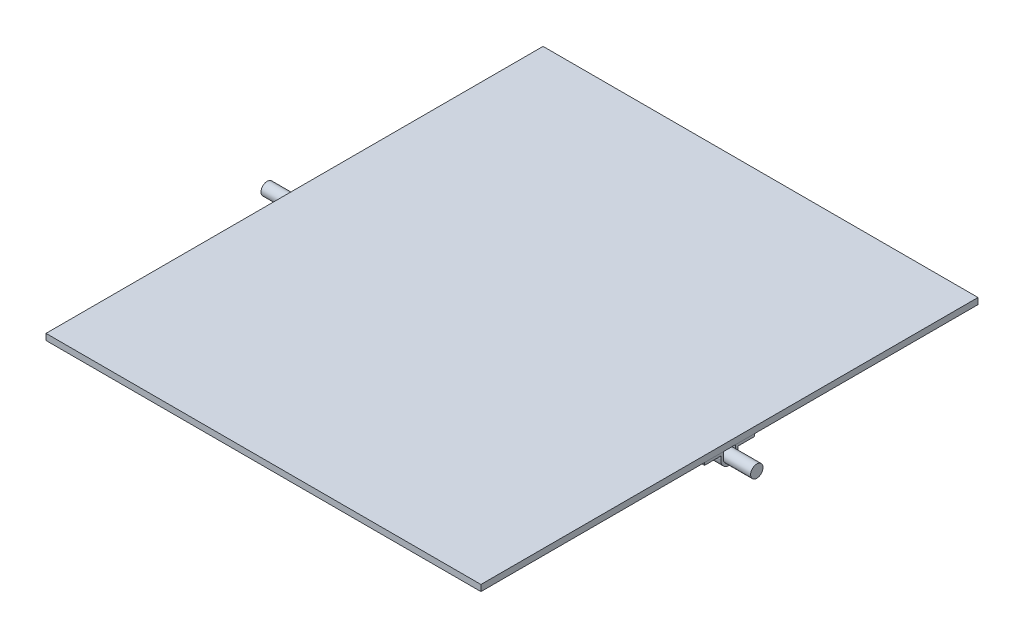
ISO-10303-21;
HEADER;
FILE_DESCRIPTION(('STEP AP214'),'2;1');
FILE_NAME('part.step','',(''),(''),'','','');
FILE_SCHEMA(('AUTOMOTIVE_DESIGN { 1 0 10303 214 1 1 1 1 }'));
ENDSEC;
DATA;
#1=APPLICATION_CONTEXT('core data for automotive mechanical design processes');
#2=APPLICATION_PROTOCOL_DEFINITION('international standard','automotive_design',2000,#1);
#3=PRODUCT_CONTEXT('',#1,'mechanical');
#4=PRODUCT('Part','Part','',(#3));
#5=PRODUCT_RELATED_PRODUCT_CATEGORY('part','',(#4));
#6=PRODUCT_DEFINITION_FORMATION('','',#4);
#7=PRODUCT_DEFINITION_CONTEXT('part definition',#1,'design');
#8=PRODUCT_DEFINITION('design','',#6,#7);
#9=PRODUCT_DEFINITION_SHAPE('','',#8);
#10=(LENGTH_UNIT() NAMED_UNIT(*) SI_UNIT(.MILLI.,.METRE.));
#11=(NAMED_UNIT(*) PLANE_ANGLE_UNIT() SI_UNIT($,.RADIAN.));
#12=(NAMED_UNIT(*) SI_UNIT($,.STERADIAN.) SOLID_ANGLE_UNIT());
#13=UNCERTAINTY_MEASURE_WITH_UNIT(LENGTH_MEASURE(1.E-05),#10,'distance_accuracy_value','');
#14=(GEOMETRIC_REPRESENTATION_CONTEXT(3) GLOBAL_UNCERTAINTY_ASSIGNED_CONTEXT((#13)) GLOBAL_UNIT_ASSIGNED_CONTEXT((#10,
#11,#12)) REPRESENTATION_CONTEXT('',''));
#15=CARTESIAN_POINT('',(0.,0.,0.));
#16=DIRECTION('',(0.,0.,1.));
#17=DIRECTION('',(1.,0.,0.));
#18=AXIS2_PLACEMENT_3D('',#15,#16,#17);
#19=CARTESIAN_POINT('',(175.,-0.01,200.01));
#20=DIRECTION('',(1.,0.,0.));
#21=DIRECTION('',(0.,0.,-1.));
#22=AXIS2_PLACEMENT_3D('',#19,#20,#21);
#23=PLANE('',#22);
#24=DIRECTION('',(0.,0.,-1.));
#25=VECTOR('',#24,1.);
#26=CARTESIAN_POINT('',(175.,5.,0.));
#27=LINE('',#26,#25);
#28=CARTESIAN_POINT('',(175.,5.,200.));
#29=VERTEX_POINT('',#28);
#30=CARTESIAN_POINT('',(175.,5.,-200.));
#31=VERTEX_POINT('',#30);
#32=EDGE_CURVE('P0_E69',#29,#31,#27,.T.);
#33=ORIENTED_EDGE('',*,*,#32,.F.);
#34=DIRECTION('',(0.,1.,0.));
#35=VECTOR('',#34,1.);
#36=CARTESIAN_POINT('',(175.,2.5,200.));
#37=LINE('',#36,#35);
#38=CARTESIAN_POINT('',(175.,0.,200.));
#39=VERTEX_POINT('',#38);
#40=EDGE_CURVE('P0_E56',#39,#29,#37,.T.);
#41=ORIENTED_EDGE('',*,*,#40,.F.);
#42=DIRECTION('',(0.,0.,1.));
#43=VECTOR('',#42,1.);
#44=CARTESIAN_POINT('',(175.,0.,0.));
#45=LINE('',#44,#43);
#46=CARTESIAN_POINT('',(175.,0.,-200.));
#47=VERTEX_POINT('',#46);
#48=EDGE_CURVE('P0_E21',#47,#39,#45,.T.);
#49=ORIENTED_EDGE('',*,*,#48,.F.);
#50=DIRECTION('',(0.,-1.,0.));
#51=VECTOR('',#50,1.);
#52=CARTESIAN_POINT('',(175.,2.5,-200.));
#53=LINE('',#52,#51);
#54=EDGE_CURVE('P0_E82',#31,#47,#53,.T.);
#55=ORIENTED_EDGE('',*,*,#54,.F.);
#56=EDGE_LOOP('',(#33,#41,#49,#55));
#57=FACE_BOUND('',#56,.T.);
#58=ADVANCED_FACE('P0_F17',(#57),#23,.T.);
#59=CARTESIAN_POINT('',(-175.01,0.,200.01));
#60=DIRECTION('',(0.,-1.,0.));
#61=DIRECTION('',(0.,0.,-1.));
#62=AXIS2_PLACEMENT_3D('',#59,#60,#61);
#63=PLANE('',#62);
#64=DIRECTION('',(-1.,0.,0.));
#65=VECTOR('',#64,1.);
#66=CARTESIAN_POINT('',(0.,0.,-200.));
#67=LINE('',#66,#65);
#68=CARTESIAN_POINT('',(-175.,0.,-200.));
#69=VERTEX_POINT('',#68);
#70=EDGE_CURVE('P0_E65',#47,#69,#67,.T.);
#71=ORIENTED_EDGE('',*,*,#70,.F.);
#72=ORIENTED_EDGE('',*,*,#48,.T.);
#73=DIRECTION('',(1.,0.,0.));
#74=VECTOR('',#73,1.);
#75=CARTESIAN_POINT('',(0.,0.,200.));
#76=LINE('',#75,#74);
#77=CARTESIAN_POINT('',(-175.,0.,200.));
#78=VERTEX_POINT('',#77);
#79=EDGE_CURVE('P0_E62',#78,#39,#76,.T.);
#80=ORIENTED_EDGE('',*,*,#79,.F.);
#81=DIRECTION('',(0.,0.,1.));
#82=VECTOR('',#81,1.);
#83=CARTESIAN_POINT('',(-175.,0.,0.));
#84=LINE('',#83,#82);
#85=EDGE_CURVE('P0_E84',#69,#78,#84,.T.);
#86=ORIENTED_EDGE('',*,*,#85,.F.);
#87=EDGE_LOOP('',(#71,#72,#80,#86));
#88=FACE_BOUND('',#87,.T.);
#89=ADVANCED_FACE('P0_F61',(#88),#63,.T.);
#90=CARTESIAN_POINT('',(-175.01,-0.01,200.));
#91=DIRECTION('',(0.,0.,1.));
#92=DIRECTION('',(1.,0.,0.));
#93=AXIS2_PLACEMENT_3D('',#90,#91,#92);
#94=PLANE('',#93);
#95=DIRECTION('',(1.,0.,0.));
#96=VECTOR('',#95,1.);
#97=CARTESIAN_POINT('',(0.,5.,200.));
#98=LINE('',#97,#96);
#99=CARTESIAN_POINT('',(-175.,5.,200.));
#100=VERTEX_POINT('',#99);
#101=EDGE_CURVE('P0_E71',#100,#29,#98,.T.);
#102=ORIENTED_EDGE('',*,*,#101,.F.);
#103=DIRECTION('',(0.,1.,0.));
#104=VECTOR('',#103,1.);
#105=CARTESIAN_POINT('',(-175.,2.5,200.));
#106=LINE('',#105,#104);
#107=EDGE_CURVE('P0_E75',#78,#100,#106,.T.);
#108=ORIENTED_EDGE('',*,*,#107,.F.);
#109=ORIENTED_EDGE('',*,*,#79,.T.);
#110=ORIENTED_EDGE('',*,*,#40,.T.);
#111=EDGE_LOOP('',(#102,#108,#109,#110));
#112=FACE_BOUND('',#111,.T.);
#113=ADVANCED_FACE('P0_F73',(#112),#94,.T.);
#114=CARTESIAN_POINT('',(-175.01,5.,-200.01));
#115=DIRECTION('',(0.,1.,0.));
#116=DIRECTION('',(0.,0.,1.));
#117=AXIS2_PLACEMENT_3D('',#114,#115,#116);
#118=PLANE('',#117);
#119=DIRECTION('',(1.,0.,0.));
#120=VECTOR('',#119,1.);
#121=CARTESIAN_POINT('',(0.,5.,-200.));
#122=LINE('',#121,#120);
#123=CARTESIAN_POINT('',(-175.,5.,-200.));
#124=VERTEX_POINT('',#123);
#125=EDGE_CURVE('P0_E36',#124,#31,#122,.T.);
#126=ORIENTED_EDGE('',*,*,#125,.F.);
#127=DIRECTION('',(0.,0.,-1.));
#128=VECTOR('',#127,1.);
#129=CARTESIAN_POINT('',(-175.,5.,0.));
#130=LINE('',#129,#128);
#131=EDGE_CURVE('P0_E27',#100,#124,#130,.T.);
#132=ORIENTED_EDGE('',*,*,#131,.F.);
#133=ORIENTED_EDGE('',*,*,#101,.T.);
#134=ORIENTED_EDGE('',*,*,#32,.T.);
#135=EDGE_LOOP('',(#126,#132,#133,#134));
#136=FACE_BOUND('',#135,.T.);
#137=ADVANCED_FACE('P0_F89',(#136),#118,.T.);
#138=CARTESIAN_POINT('',(175.01,-0.01,-200.));
#139=DIRECTION('',(0.,0.,-1.));
#140=DIRECTION('',(-1.,0.,0.));
#141=AXIS2_PLACEMENT_3D('',#138,#139,#140);
#142=PLANE('',#141);
#143=ORIENTED_EDGE('',*,*,#125,.T.);
#144=ORIENTED_EDGE('',*,*,#54,.T.);
#145=ORIENTED_EDGE('',*,*,#70,.T.);
#146=DIRECTION('',(0.,-1.,0.));
#147=VECTOR('',#146,1.);
#148=CARTESIAN_POINT('',(-175.,2.5,-200.));
#149=LINE('',#148,#147);
#150=EDGE_CURVE('P0_E11',#124,#69,#149,.T.);
#151=ORIENTED_EDGE('',*,*,#150,.F.);
#152=EDGE_LOOP('',(#143,#144,#145,#151));
#153=FACE_BOUND('',#152,.T.);
#154=ADVANCED_FACE('P0_F91',(#153),#142,.T.);
#155=CARTESIAN_POINT('',(-175.,-0.01,-200.01));
#156=DIRECTION('',(-1.,0.,0.));
#157=DIRECTION('',(0.,0.,1.));
#158=AXIS2_PLACEMENT_3D('',#155,#156,#157);
#159=PLANE('',#158);
#160=ORIENTED_EDGE('',*,*,#131,.T.);
#161=ORIENTED_EDGE('',*,*,#150,.T.);
#162=ORIENTED_EDGE('',*,*,#85,.T.);
#163=ORIENTED_EDGE('',*,*,#107,.T.);
#164=EDGE_LOOP('',(#160,#161,#162,#163));
#165=FACE_BOUND('',#164,.T.);
#166=ADVANCED_FACE('P0_F19',(#165),#159,.T.);
#167=CLOSED_SHELL('',(#58,#89,#113,#137,#154,#166));
#168=MANIFOLD_SOLID_BREP('P0_B1',#167);
#169=CARTESIAN_POINT('',(197.,-10.01,5.01));
#170=DIRECTION('',(1.,0.,0.));
#171=DIRECTION('',(0.,0.,-1.));
#172=AXIS2_PLACEMENT_3D('',#169,#170,#171);
#173=PLANE('',#172);
#174=CARTESIAN_POINT('',(197.,-5.,0.));
#175=DIRECTION('',(-1.,0.,0.));
#176=DIRECTION('',(0.,0.,1.));
#177=AXIS2_PLACEMENT_3D('',#174,#175,#176);
#178=CIRCLE('',#177,5.);
#179=CARTESIAN_POINT('',(197.,-5.,5.));
#180=VERTEX_POINT('',#179);
#181=EDGE_CURVE('P1_E19',#180,#180,#178,.T.);
#182=ORIENTED_EDGE('',*,*,#181,.F.);
#183=EDGE_LOOP('',(#182));
#184=FACE_BOUND('',#183,.T.);
#185=ADVANCED_FACE('P1_F15',(#184),#173,.T.);
#186=CARTESIAN_POINT('',(197.,-5.,0.));
#187=DIRECTION('',(-1.,0.,0.));
#188=DIRECTION('',(0.,0.,1.));
#189=AXIS2_PLACEMENT_3D('',#186,#187,#188);
#190=CYLINDRICAL_SURFACE('',#189,5.);
#191=CARTESIAN_POINT('',(-197.,-5.,0.));
#192=DIRECTION('',(-1.,0.,0.));
#193=DIRECTION('',(0.,0.,1.));
#194=AXIS2_PLACEMENT_3D('',#191,#192,#193);
#195=CIRCLE('',#194,5.);
#196=CARTESIAN_POINT('',(-197.,-5.,5.));
#197=VERTEX_POINT('',#196);
#198=EDGE_CURVE('P1_E10',#197,#197,#195,.T.);
#199=ORIENTED_EDGE('',*,*,#198,.F.);
#200=EDGE_LOOP('',(#199));
#201=FACE_BOUND('',#200,.T.);
#202=ORIENTED_EDGE('',*,*,#181,.T.);
#203=EDGE_LOOP('',(#202));
#204=FACE_BOUND('',#203,.T.);
#205=ADVANCED_FACE('P1_F28',(#201,#204),#190,.T.);
#206=CARTESIAN_POINT('',(-197.,-10.01,-5.01));
#207=DIRECTION('',(-1.,0.,0.));
#208=DIRECTION('',(0.,0.,1.));
#209=AXIS2_PLACEMENT_3D('',#206,#207,#208);
#210=PLANE('',#209);
#211=ORIENTED_EDGE('',*,*,#198,.T.);
#212=EDGE_LOOP('',(#211));
#213=FACE_BOUND('',#212,.T.);
#214=ADVANCED_FACE('P1_F17',(#213),#210,.T.);
#215=CLOSED_SHELL('',(#185,#205,#214));
#216=MANIFOLD_SOLID_BREP('P1_B1',#215);
#217=CARTESIAN_POINT('',(175.01,0.01,5.));
#218=DIRECTION('',(0.,0.,-1.));
#219=DIRECTION('',(0.,-1.,0.));
#220=AXIS2_PLACEMENT_3D('',#217,#218,#219);
#221=PLANE('',#220);
#222=DIRECTION('',(0.,-1.,0.));
#223=VECTOR('',#222,1.);
#224=CARTESIAN_POINT('',(165.,-6.,5.));
#225=LINE('',#224,#223);
#226=CARTESIAN_POINT('',(165.,0.,5.));
#227=VERTEX_POINT('',#226);
#228=CARTESIAN_POINT('',(165.,-5.,5.));
#229=VERTEX_POINT('',#228);
#230=EDGE_CURVE('P2_E188',#227,#229,#225,.T.);
#231=ORIENTED_EDGE('',*,*,#230,.F.);
#232=DIRECTION('',(-1.,0.,0.));
#233=VECTOR('',#232,1.);
#234=CARTESIAN_POINT('',(170.,0.,5.));
#235=LINE('',#234,#233);
#236=CARTESIAN_POINT('',(175.,0.,5.));
#237=VERTEX_POINT('',#236);
#238=EDGE_CURVE('P2_E189',#237,#227,#235,.T.);
#239=ORIENTED_EDGE('',*,*,#238,.F.);
#240=DIRECTION('',(0.,1.,0.));
#241=VECTOR('',#240,1.);
#242=CARTESIAN_POINT('',(175.,-6.,5.));
#243=LINE('',#242,#241);
#244=CARTESIAN_POINT('',(175.,-5.,5.));
#245=VERTEX_POINT('',#244);
#246=EDGE_CURVE('P2_E207',#245,#237,#243,.T.);
#247=ORIENTED_EDGE('',*,*,#246,.F.);
#248=DIRECTION('',(1.,0.,0.));
#249=VECTOR('',#248,1.);
#250=CARTESIAN_POINT('',(170.,-5.,5.));
#251=LINE('',#250,#249);
#252=EDGE_CURVE('P2_E183',#229,#245,#251,.T.);
#253=ORIENTED_EDGE('',*,*,#252,.F.);
#254=EDGE_LOOP('',(#231,#239,#247,#253));
#255=FACE_BOUND('',#254,.T.);
#256=ADVANCED_FACE('P2_F17',(#255),#221,.T.);
#257=CARTESIAN_POINT('',(175.,-5.,0.));
#258=DIRECTION('',(-1.,0.,0.));
#259=DIRECTION('',(0.,0.,1.));
#260=AXIS2_PLACEMENT_3D('',#257,#258,#259);
#261=CYLINDRICAL_SURFACE('',#260,5.);
#262=CARTESIAN_POINT('',(165.,-5.,0.));
#263=DIRECTION('',(-1.,0.,0.));
#264=DIRECTION('',(0.,0.,1.));
#265=AXIS2_PLACEMENT_3D('',#262,#263,#264);
#266=CIRCLE('',#265,5.);
#267=CARTESIAN_POINT('',(165.,-5.,-4.99999999999996));
#268=VERTEX_POINT('',#267);
#269=EDGE_CURVE('P2_E234',#229,#268,#266,.F.);
#270=ORIENTED_EDGE('',*,*,#269,.F.);
#271=ORIENTED_EDGE('',*,*,#252,.T.);
#272=CARTESIAN_POINT('',(175.,-5.,0.));
#273=DIRECTION('',(-1.,0.,0.));
#274=DIRECTION('',(0.,0.,1.));
#275=AXIS2_PLACEMENT_3D('',#272,#273,#274);
#276=CIRCLE('',#275,5.);
#277=CARTESIAN_POINT('',(175.,-5.,-4.99999999999998));
#278=VERTEX_POINT('',#277);
#279=EDGE_CURVE('P2_E236',#278,#245,#276,.T.);
#280=ORIENTED_EDGE('',*,*,#279,.F.);
#281=DIRECTION('',(1.,0.,0.));
#282=VECTOR('',#281,1.);
#283=CARTESIAN_POINT('',(170.,-5.,-4.99999999999996));
#284=LINE('',#283,#282);
#285=EDGE_CURVE('P2_E179',#268,#278,#284,.T.);
#286=ORIENTED_EDGE('',*,*,#285,.F.);
#287=EDGE_LOOP('',(#270,#271,#280,#286));
#288=FACE_BOUND('',#287,.T.);
#289=ADVANCED_FACE('P2_F275',(#288),#261,.F.);
#290=CARTESIAN_POINT('',(175.01,-5.01,-4.99999999999996));
#291=DIRECTION('',(0.,0.,1.));
#292=DIRECTION('',(0.,1.,0.));
#293=AXIS2_PLACEMENT_3D('',#290,#291,#292);
#294=PLANE('',#293);
#295=DIRECTION('',(0.,1.,0.));
#296=VECTOR('',#295,1.);
#297=CARTESIAN_POINT('',(165.,-6.,-4.99999999999996));
#298=LINE('',#297,#296);
#299=CARTESIAN_POINT('',(165.,0.,-4.99999999999998));
#300=VERTEX_POINT('',#299);
#301=EDGE_CURVE('P2_E175',#268,#300,#298,.T.);
#302=ORIENTED_EDGE('',*,*,#301,.F.);
#303=ORIENTED_EDGE('',*,*,#285,.T.);
#304=DIRECTION('',(0.,-1.,0.));
#305=VECTOR('',#304,1.);
#306=CARTESIAN_POINT('',(175.,-6.,-5.));
#307=LINE('',#306,#305);
#308=CARTESIAN_POINT('',(175.,0.,-5.));
#309=VERTEX_POINT('',#308);
#310=EDGE_CURVE('P2_E217',#309,#278,#307,.T.);
#311=ORIENTED_EDGE('',*,*,#310,.F.);
#312=DIRECTION('',(1.,0.,0.));
#313=VECTOR('',#312,1.);
#314=CARTESIAN_POINT('',(170.,0.,-5.));
#315=LINE('',#314,#313);
#316=EDGE_CURVE('P2_E170',#300,#309,#315,.T.);
#317=ORIENTED_EDGE('',*,*,#316,.F.);
#318=EDGE_LOOP('',(#302,#303,#311,#317));
#319=FACE_BOUND('',#318,.T.);
#320=ADVANCED_FACE('P2_F279',(#319),#294,.T.);
#321=CARTESIAN_POINT('',(175.01,0.,-4.99));
#322=DIRECTION('',(0.,1.,0.));
#323=DIRECTION('',(0.,0.,-1.));
#324=AXIS2_PLACEMENT_3D('',#321,#322,#323);
#325=PLANE('',#324);
#326=DIRECTION('',(0.,0.,-1.));
#327=VECTOR('',#326,1.);
#328=CARTESIAN_POINT('',(165.,0.,0.));
#329=LINE('',#328,#327);
#330=CARTESIAN_POINT('',(165.,0.,-20.));
#331=VERTEX_POINT('',#330);
#332=EDGE_CURVE('P2_E166',#300,#331,#329,.T.);
#333=ORIENTED_EDGE('',*,*,#332,.F.);
#334=ORIENTED_EDGE('',*,*,#316,.T.);
#335=DIRECTION('',(0.,0.,1.));
#336=VECTOR('',#335,1.);
#337=CARTESIAN_POINT('',(175.,0.,0.));
#338=LINE('',#337,#336);
#339=CARTESIAN_POINT('',(175.,0.,-20.));
#340=VERTEX_POINT('',#339);
#341=EDGE_CURVE('P2_E214',#340,#309,#338,.T.);
#342=ORIENTED_EDGE('',*,*,#341,.F.);
#343=DIRECTION('',(1.,0.,0.));
#344=VECTOR('',#343,1.);
#345=CARTESIAN_POINT('',(170.,0.,-20.));
#346=LINE('',#345,#344);
#347=EDGE_CURVE('P2_E161',#331,#340,#346,.T.);
#348=ORIENTED_EDGE('',*,*,#347,.F.);
#349=EDGE_LOOP('',(#333,#334,#342,#348));
#350=FACE_BOUND('',#349,.T.);
#351=ADVANCED_FACE('P2_F282',(#350),#325,.T.);
#352=CARTESIAN_POINT('',(175.01,0.01,-20.));
#353=DIRECTION('',(0.,0.,-1.));
#354=DIRECTION('',(0.,-1.,0.));
#355=AXIS2_PLACEMENT_3D('',#352,#353,#354);
#356=PLANE('',#355);
#357=DIRECTION('',(0.,-1.,0.));
#358=VECTOR('',#357,1.);
#359=CARTESIAN_POINT('',(165.,-6.,-20.));
#360=LINE('',#359,#358);
#361=CARTESIAN_POINT('',(165.,-1.99999999999999,-20.));
#362=VERTEX_POINT('',#361);
#363=EDGE_CURVE('P2_E157',#331,#362,#360,.T.);
#364=ORIENTED_EDGE('',*,*,#363,.F.);
#365=ORIENTED_EDGE('',*,*,#347,.T.);
#366=DIRECTION('',(0.,1.,0.));
#367=VECTOR('',#366,1.);
#368=CARTESIAN_POINT('',(175.,-6.,-20.));
#369=LINE('',#368,#367);
#370=CARTESIAN_POINT('',(175.,-1.99999999999999,-20.));
#371=VERTEX_POINT('',#370);
#372=EDGE_CURVE('P2_E218',#371,#340,#369,.T.);
#373=ORIENTED_EDGE('',*,*,#372,.F.);
#374=DIRECTION('',(1.,0.,0.));
#375=VECTOR('',#374,1.);
#376=CARTESIAN_POINT('',(170.,-1.99999999999999,-20.));
#377=LINE('',#376,#375);
#378=EDGE_CURVE('P2_E150',#362,#371,#377,.T.);
#379=ORIENTED_EDGE('',*,*,#378,.F.);
#380=EDGE_LOOP('',(#364,#365,#373,#379));
#381=FACE_BOUND('',#380,.T.);
#382=ADVANCED_FACE('P2_F286',(#381),#356,.T.);
#383=CARTESIAN_POINT('',(175.01,-1.99999999999999,-20.01));
#384=DIRECTION('',(0.,-1.,0.));
#385=DIRECTION('',(0.,0.,1.));
#386=AXIS2_PLACEMENT_3D('',#383,#384,#385);
#387=PLANE('',#386);
#388=DIRECTION('',(0.,0.,1.));
#389=VECTOR('',#388,1.);
#390=CARTESIAN_POINT('',(165.,-1.99999999999999,0.));
#391=LINE('',#390,#389);
#392=CARTESIAN_POINT('',(165.,-1.99999999999999,-6.99999999999999));
#393=VERTEX_POINT('',#392);
#394=EDGE_CURVE('P2_E153',#362,#393,#391,.T.);
#395=ORIENTED_EDGE('',*,*,#394,.F.);
#396=ORIENTED_EDGE('',*,*,#378,.T.);
#397=DIRECTION('',(0.,0.,-1.));
#398=VECTOR('',#397,1.);
#399=CARTESIAN_POINT('',(175.,-1.99999999999999,0.));
#400=LINE('',#399,#398);
#401=CARTESIAN_POINT('',(175.,-1.99999999999999,-6.99999999999999));
#402=VERTEX_POINT('',#401);
#403=EDGE_CURVE('P2_E126',#402,#371,#400,.T.);
#404=ORIENTED_EDGE('',*,*,#403,.F.);
#405=DIRECTION('',(1.,0.,0.));
#406=VECTOR('',#405,1.);
#407=CARTESIAN_POINT('',(170.,-1.99999999999999,-6.99999999999999));
#408=LINE('',#407,#406);
#409=EDGE_CURVE('P2_E118',#393,#402,#408,.T.);
#410=ORIENTED_EDGE('',*,*,#409,.F.);
#411=EDGE_LOOP('',(#395,#396,#404,#410));
#412=FACE_BOUND('',#411,.T.);
#413=ADVANCED_FACE('P2_F289',(#412),#387,.T.);
#414=CARTESIAN_POINT('',(175.01,-1.98999999999999,-6.99999999999999));
#415=DIRECTION('',(0.,0.,-1.));
#416=DIRECTION('',(0.,-1.,0.));
#417=AXIS2_PLACEMENT_3D('',#414,#415,#416);
#418=PLANE('',#417);
#419=DIRECTION('',(0.,-1.,0.));
#420=VECTOR('',#419,1.);
#421=CARTESIAN_POINT('',(165.,-6.,-6.99999999999999));
#422=LINE('',#421,#420);
#423=CARTESIAN_POINT('',(165.,-5.,-6.99999999999999));
#424=VERTEX_POINT('',#423);
#425=EDGE_CURVE('P2_E156',#393,#424,#422,.T.);
#426=ORIENTED_EDGE('',*,*,#425,.F.);
#427=ORIENTED_EDGE('',*,*,#409,.T.);
#428=DIRECTION('',(0.,1.,0.));
#429=VECTOR('',#428,1.);
#430=CARTESIAN_POINT('',(175.,-6.,-7.));
#431=LINE('',#430,#429);
#432=CARTESIAN_POINT('',(175.,-5.,-6.99999999999999));
#433=VERTEX_POINT('',#432);
#434=EDGE_CURVE('P2_E121',#433,#402,#431,.T.);
#435=ORIENTED_EDGE('',*,*,#434,.F.);
#436=DIRECTION('',(1.,0.,0.));
#437=VECTOR('',#436,1.);
#438=CARTESIAN_POINT('',(170.,-5.,-6.99999999999999));
#439=LINE('',#438,#437);
#440=EDGE_CURVE('P2_E108',#424,#433,#439,.T.);
#441=ORIENTED_EDGE('',*,*,#440,.F.);
#442=EDGE_LOOP('',(#426,#427,#435,#441));
#443=FACE_BOUND('',#442,.T.);
#444=ADVANCED_FACE('P2_F122',(#443),#418,.T.);
#445=CARTESIAN_POINT('',(165.,-5.,0.));
#446=DIRECTION('',(1.,0.,0.));
#447=DIRECTION('',(0.,0.,-1.));
#448=AXIS2_PLACEMENT_3D('',#445,#446,#447);
#449=CYLINDRICAL_SURFACE('',#448,6.99999999999999);
#450=CARTESIAN_POINT('',(165.,-5.,0.));
#451=DIRECTION('',(1.,0.,0.));
#452=DIRECTION('',(0.,0.,-1.));
#453=AXIS2_PLACEMENT_3D('',#450,#451,#452);
#454=CIRCLE('',#453,6.99999999999999);
#455=CARTESIAN_POINT('',(165.,-5.,6.99999999999999));
#456=VERTEX_POINT('',#455);
#457=EDGE_CURVE('P2_E114',#424,#456,#454,.F.);
#458=ORIENTED_EDGE('',*,*,#457,.F.);
#459=ORIENTED_EDGE('',*,*,#440,.T.);
#460=CARTESIAN_POINT('',(175.,-5.,0.));
#461=DIRECTION('',(1.,0.,0.));
#462=DIRECTION('',(0.,0.,-1.));
#463=AXIS2_PLACEMENT_3D('',#460,#461,#462);
#464=CIRCLE('',#463,6.99999999999999);
#465=CARTESIAN_POINT('',(175.,-5.,6.99999999999999));
#466=VERTEX_POINT('',#465);
#467=EDGE_CURVE('P2_E21',#466,#433,#464,.T.);
#468=ORIENTED_EDGE('',*,*,#467,.F.);
#469=DIRECTION('',(1.,0.,0.));
#470=VECTOR('',#469,1.);
#471=CARTESIAN_POINT('',(170.,-5.,6.99999999999999));
#472=LINE('',#471,#470);
#473=EDGE_CURVE('P2_E103',#456,#466,#472,.T.);
#474=ORIENTED_EDGE('',*,*,#473,.F.);
#475=EDGE_LOOP('',(#458,#459,#468,#474));
#476=FACE_BOUND('',#475,.T.);
#477=ADVANCED_FACE('P2_F110',(#476),#449,.T.);
#478=CARTESIAN_POINT('',(175.01,-5.01,6.99999999999999));
#479=DIRECTION('',(0.,0.,1.));
#480=DIRECTION('',(0.,1.,0.));
#481=AXIS2_PLACEMENT_3D('',#478,#479,#480);
#482=PLANE('',#481);
#483=DIRECTION('',(0.,1.,0.));
#484=VECTOR('',#483,1.);
#485=CARTESIAN_POINT('',(165.,-6.,6.99999999999999));
#486=LINE('',#485,#484);
#487=CARTESIAN_POINT('',(165.,-1.99999999999999,6.99999999999999));
#488=VERTEX_POINT('',#487);
#489=EDGE_CURVE('P2_E230',#456,#488,#486,.T.);
#490=ORIENTED_EDGE('',*,*,#489,.F.);
#491=ORIENTED_EDGE('',*,*,#473,.T.);
#492=DIRECTION('',(0.,-1.,0.));
#493=VECTOR('',#492,1.);
#494=CARTESIAN_POINT('',(175.,-6.,6.99999999999999));
#495=LINE('',#494,#493);
#496=CARTESIAN_POINT('',(175.,-1.99999999999999,6.99999999999999));
#497=VERTEX_POINT('',#496);
#498=EDGE_CURVE('P2_E131',#497,#466,#495,.T.);
#499=ORIENTED_EDGE('',*,*,#498,.F.);
#500=DIRECTION('',(1.,0.,0.));
#501=VECTOR('',#500,1.);
#502=CARTESIAN_POINT('',(170.,-1.99999999999999,6.99999999999999));
#503=LINE('',#502,#501);
#504=EDGE_CURVE('P2_E139',#488,#497,#503,.T.);
#505=ORIENTED_EDGE('',*,*,#504,.F.);
#506=EDGE_LOOP('',(#490,#491,#499,#505));
#507=FACE_BOUND('',#506,.T.);
#508=ADVANCED_FACE('P2_F262',(#507),#482,.T.);
#509=CARTESIAN_POINT('',(175.,-12.01,20.01));
#510=DIRECTION('',(1.,0.,0.));
#511=DIRECTION('',(0.,0.,-1.));
#512=AXIS2_PLACEMENT_3D('',#509,#510,#511);
#513=PLANE('',#512);
#514=ORIENTED_EDGE('',*,*,#279,.T.);
#515=ORIENTED_EDGE('',*,*,#246,.T.);
#516=DIRECTION('',(0.,0.,-1.));
#517=VECTOR('',#516,1.);
#518=CARTESIAN_POINT('',(175.,0.,12.5));
#519=LINE('',#518,#517);
#520=CARTESIAN_POINT('',(175.,0.,20.));
#521=VERTEX_POINT('',#520);
#522=EDGE_CURVE('P2_E193',#521,#237,#519,.T.);
#523=ORIENTED_EDGE('',*,*,#522,.F.);
#524=DIRECTION('',(0.,1.,0.));
#525=VECTOR('',#524,1.);
#526=CARTESIAN_POINT('',(175.,-1.,20.));
#527=LINE('',#526,#525);
#528=CARTESIAN_POINT('',(175.,-2.,20.));
#529=VERTEX_POINT('',#528);
#530=EDGE_CURVE('P2_E142',#529,#521,#527,.T.);
#531=ORIENTED_EDGE('',*,*,#530,.F.);
#532=DIRECTION('',(0.,0.,1.));
#533=VECTOR('',#532,1.);
#534=CARTESIAN_POINT('',(175.,-1.99999999999999,13.5));
#535=LINE('',#534,#533);
#536=EDGE_CURVE('P2_E146',#497,#529,#535,.T.);
#537=ORIENTED_EDGE('',*,*,#536,.F.);
#538=ORIENTED_EDGE('',*,*,#498,.T.);
#539=ORIENTED_EDGE('',*,*,#467,.T.);
#540=ORIENTED_EDGE('',*,*,#434,.T.);
#541=ORIENTED_EDGE('',*,*,#403,.T.);
#542=ORIENTED_EDGE('',*,*,#372,.T.);
#543=ORIENTED_EDGE('',*,*,#341,.T.);
#544=ORIENTED_EDGE('',*,*,#310,.T.);
#545=EDGE_LOOP('',(#514,#515,#523,#531,#537,#538,#539,#540,#541,#542,#543,#544));
#546=FACE_BOUND('',#545,.T.);
#547=ADVANCED_FACE('P2_F129',(#546),#513,.T.);
#548=CARTESIAN_POINT('',(175.01,0.,20.01));
#549=DIRECTION('',(0.,1.,0.));
#550=DIRECTION('',(0.,0.,-1.));
#551=AXIS2_PLACEMENT_3D('',#548,#549,#550);
#552=PLANE('',#551);
#553=DIRECTION('',(0.,0.,-1.));
#554=VECTOR('',#553,1.);
#555=CARTESIAN_POINT('',(165.,0.,0.));
#556=LINE('',#555,#554);
#557=CARTESIAN_POINT('',(165.,0.,20.));
#558=VERTEX_POINT('',#557);
#559=EDGE_CURVE('P2_E185',#558,#227,#556,.T.);
#560=ORIENTED_EDGE('',*,*,#559,.F.);
#561=DIRECTION('',(-1.,0.,0.));
#562=VECTOR('',#561,1.);
#563=CARTESIAN_POINT('',(170.,0.,20.));
#564=LINE('',#563,#562);
#565=EDGE_CURVE('P2_E198',#521,#558,#564,.T.);
#566=ORIENTED_EDGE('',*,*,#565,.F.);
#567=ORIENTED_EDGE('',*,*,#522,.T.);
#568=ORIENTED_EDGE('',*,*,#238,.T.);
#569=EDGE_LOOP('',(#560,#566,#567,#568));
#570=FACE_BOUND('',#569,.T.);
#571=ADVANCED_FACE('P2_F269',(#570),#552,.T.);
#572=CARTESIAN_POINT('',(165.,-12.01,-20.01));
#573=DIRECTION('',(-1.,0.,0.));
#574=DIRECTION('',(0.,0.,1.));
#575=AXIS2_PLACEMENT_3D('',#572,#573,#574);
#576=PLANE('',#575);
#577=DIRECTION('',(0.,0.,-1.));
#578=VECTOR('',#577,1.);
#579=CARTESIAN_POINT('',(165.,-1.99999999999999,13.5));
#580=LINE('',#579,#578);
#581=CARTESIAN_POINT('',(165.,-2.,20.));
#582=VERTEX_POINT('',#581);
#583=EDGE_CURVE('P2_E36',#582,#488,#580,.T.);
#584=ORIENTED_EDGE('',*,*,#583,.F.);
#585=DIRECTION('',(0.,-1.,0.));
#586=VECTOR('',#585,1.);
#587=CARTESIAN_POINT('',(165.,-1.,20.));
#588=LINE('',#587,#586);
#589=EDGE_CURVE('P2_E27',#558,#582,#588,.T.);
#590=ORIENTED_EDGE('',*,*,#589,.F.);
#591=ORIENTED_EDGE('',*,*,#559,.T.);
#592=ORIENTED_EDGE('',*,*,#230,.T.);
#593=ORIENTED_EDGE('',*,*,#269,.T.);
#594=ORIENTED_EDGE('',*,*,#301,.T.);
#595=ORIENTED_EDGE('',*,*,#332,.T.);
#596=ORIENTED_EDGE('',*,*,#363,.T.);
#597=ORIENTED_EDGE('',*,*,#394,.T.);
#598=ORIENTED_EDGE('',*,*,#425,.T.);
#599=ORIENTED_EDGE('',*,*,#457,.T.);
#600=ORIENTED_EDGE('',*,*,#489,.T.);
#601=EDGE_LOOP('',(#584,#590,#591,#592,#593,#594,#595,#596,#597,#598,#599,#600));
#602=FACE_BOUND('',#601,.T.);
#603=ADVANCED_FACE('P2_F261',(#602),#576,.T.);
#604=CARTESIAN_POINT('',(175.01,-1.99999999999999,6.98999999999999));
#605=DIRECTION('',(0.,-1.,0.));
#606=DIRECTION('',(0.,0.,1.));
#607=AXIS2_PLACEMENT_3D('',#604,#605,#606);
#608=PLANE('',#607);
#609=ORIENTED_EDGE('',*,*,#583,.T.);
#610=ORIENTED_EDGE('',*,*,#504,.T.);
#611=ORIENTED_EDGE('',*,*,#536,.T.);
#612=DIRECTION('',(1.,0.,0.));
#613=VECTOR('',#612,1.);
#614=CARTESIAN_POINT('',(170.,-2.,20.));
#615=LINE('',#614,#613);
#616=EDGE_CURVE('P2_E11',#582,#529,#615,.T.);
#617=ORIENTED_EDGE('',*,*,#616,.F.);
#618=EDGE_LOOP('',(#609,#610,#611,#617));
#619=FACE_BOUND('',#618,.T.);
#620=ADVANCED_FACE('P2_F264',(#619),#608,.T.);
#621=CARTESIAN_POINT('',(175.01,-2.01,20.));
#622=DIRECTION('',(0.,0.,1.));
#623=DIRECTION('',(0.,1.,0.));
#624=AXIS2_PLACEMENT_3D('',#621,#622,#623);
#625=PLANE('',#624);
#626=ORIENTED_EDGE('',*,*,#589,.T.);
#627=ORIENTED_EDGE('',*,*,#616,.T.);
#628=ORIENTED_EDGE('',*,*,#530,.T.);
#629=ORIENTED_EDGE('',*,*,#565,.T.);
#630=EDGE_LOOP('',(#626,#627,#628,#629));
#631=FACE_BOUND('',#630,.T.);
#632=ADVANCED_FACE('P2_F19',(#631),#625,.T.);
#633=CLOSED_SHELL('',(#256,#289,#320,#351,#382,#413,#444,#477,#508,#547,#571,#603,#620,#632));
#634=MANIFOLD_SOLID_BREP('P2_B1',#633);
#635=CARTESIAN_POINT('',(-175.01,-1.98999999999999,6.99999999999999));
#636=DIRECTION('',(0.,0.,1.));
#637=DIRECTION('',(0.,-1.,0.));
#638=AXIS2_PLACEMENT_3D('',#635,#636,#637);
#639=PLANE('',#638);
#640=DIRECTION('',(0.,-1.,0.));
#641=VECTOR('',#640,1.);
#642=CARTESIAN_POINT('',(-165.,-6.,6.99999999999999));
#643=LINE('',#642,#641);
#644=CARTESIAN_POINT('',(-165.,-2.,6.99999999999999));
#645=VERTEX_POINT('',#644);
#646=CARTESIAN_POINT('',(-165.,-5.,6.99999999999999));
#647=VERTEX_POINT('',#646);
#648=EDGE_CURVE('P3_E187',#645,#647,#643,.T.);
#649=ORIENTED_EDGE('',*,*,#648,.F.);
#650=DIRECTION('',(1.,0.,0.));
#651=VECTOR('',#650,1.);
#652=CARTESIAN_POINT('',(-170.,-1.99999999999999,6.99999999999999));
#653=LINE('',#652,#651);
#654=CARTESIAN_POINT('',(-175.,-1.99999999999999,6.99999999999999));
#655=VERTEX_POINT('',#654);
#656=EDGE_CURVE('P3_E188',#655,#645,#653,.T.);
#657=ORIENTED_EDGE('',*,*,#656,.F.);
#658=DIRECTION('',(0.,1.,0.));
#659=VECTOR('',#658,1.);
#660=CARTESIAN_POINT('',(-175.,-6.,7.));
#661=LINE('',#660,#659);
#662=CARTESIAN_POINT('',(-175.,-5.,6.99999999999999));
#663=VERTEX_POINT('',#662);
#664=EDGE_CURVE('P3_E206',#663,#655,#661,.T.);
#665=ORIENTED_EDGE('',*,*,#664,.F.);
#666=DIRECTION('',(-1.,0.,0.));
#667=VECTOR('',#666,1.);
#668=CARTESIAN_POINT('',(-170.,-5.,6.99999999999999));
#669=LINE('',#668,#667);
#670=EDGE_CURVE('P3_E182',#647,#663,#669,.T.);
#671=ORIENTED_EDGE('',*,*,#670,.F.);
#672=EDGE_LOOP('',(#649,#657,#665,#671));
#673=FACE_BOUND('',#672,.T.);
#674=ADVANCED_FACE('P3_F17',(#673),#639,.T.);
#675=CARTESIAN_POINT('',(-175.,-5.,0.));
#676=DIRECTION('',(1.,0.,0.));
#677=DIRECTION('',(0.,0.,-1.));
#678=AXIS2_PLACEMENT_3D('',#675,#676,#677);
#679=CYLINDRICAL_SURFACE('',#678,6.99999999999999);
#680=CARTESIAN_POINT('',(-165.,-5.,0.));
#681=DIRECTION('',(1.,0.,0.));
#682=DIRECTION('',(0.,0.,-1.));
#683=AXIS2_PLACEMENT_3D('',#680,#681,#682);
#684=CIRCLE('',#683,6.99999999999999);
#685=CARTESIAN_POINT('',(-165.,-5.,-6.99999999999999));
#686=VERTEX_POINT('',#685);
#687=EDGE_CURVE('P3_E233',#647,#686,#684,.T.);
#688=ORIENTED_EDGE('',*,*,#687,.F.);
#689=ORIENTED_EDGE('',*,*,#670,.T.);
#690=CARTESIAN_POINT('',(-175.,-5.,0.));
#691=DIRECTION('',(1.,0.,0.));
#692=DIRECTION('',(0.,0.,-1.));
#693=AXIS2_PLACEMENT_3D('',#690,#691,#692);
#694=CIRCLE('',#693,6.99999999999999);
#695=CARTESIAN_POINT('',(-175.,-5.,-6.99999999999999));
#696=VERTEX_POINT('',#695);
#697=EDGE_CURVE('P3_E235',#696,#663,#694,.F.);
#698=ORIENTED_EDGE('',*,*,#697,.F.);
#699=DIRECTION('',(-1.,0.,0.));
#700=VECTOR('',#699,1.);
#701=CARTESIAN_POINT('',(-170.,-5.,-6.99999999999999));
#702=LINE('',#701,#700);
#703=EDGE_CURVE('P3_E178',#686,#696,#702,.T.);
#704=ORIENTED_EDGE('',*,*,#703,.F.);
#705=EDGE_LOOP('',(#688,#689,#698,#704));
#706=FACE_BOUND('',#705,.T.);
#707=ADVANCED_FACE('P3_F275',(#706),#679,.T.);
#708=CARTESIAN_POINT('',(-175.01,-5.01,-6.99999999999999));
#709=DIRECTION('',(0.,0.,-1.));
#710=DIRECTION('',(0.,1.,0.));
#711=AXIS2_PLACEMENT_3D('',#708,#709,#710);
#712=PLANE('',#711);
#713=DIRECTION('',(0.,1.,0.));
#714=VECTOR('',#713,1.);
#715=CARTESIAN_POINT('',(-165.,-6.,-6.99999999999999));
#716=LINE('',#715,#714);
#717=CARTESIAN_POINT('',(-165.,-1.99999999999999,-6.99999999999999));
#718=VERTEX_POINT('',#717);
#719=EDGE_CURVE('P3_E174',#686,#718,#716,.T.);
#720=ORIENTED_EDGE('',*,*,#719,.F.);
#721=ORIENTED_EDGE('',*,*,#703,.T.);
#722=DIRECTION('',(0.,-1.,0.));
#723=VECTOR('',#722,1.);
#724=CARTESIAN_POINT('',(-175.,-6.,-6.99999999999999));
#725=LINE('',#724,#723);
#726=CARTESIAN_POINT('',(-175.,-1.99999999999999,-6.99999999999999));
#727=VERTEX_POINT('',#726);
#728=EDGE_CURVE('P3_E216',#727,#696,#725,.T.);
#729=ORIENTED_EDGE('',*,*,#728,.F.);
#730=DIRECTION('',(-1.,0.,0.));
#731=VECTOR('',#730,1.);
#732=CARTESIAN_POINT('',(-170.,-1.99999999999999,-6.99999999999999));
#733=LINE('',#732,#731);
#734=EDGE_CURVE('P3_E169',#718,#727,#733,.T.);
#735=ORIENTED_EDGE('',*,*,#734,.F.);
#736=EDGE_LOOP('',(#720,#721,#729,#735));
#737=FACE_BOUND('',#736,.T.);
#738=ADVANCED_FACE('P3_F279',(#737),#712,.T.);
#739=CARTESIAN_POINT('',(-175.01,-1.99999999999999,-6.98999999999999));
#740=DIRECTION('',(0.,-1.,0.));
#741=DIRECTION('',(0.,0.,-1.));
#742=AXIS2_PLACEMENT_3D('',#739,#740,#741);
#743=PLANE('',#742);
#744=DIRECTION('',(0.,0.,-1.));
#745=VECTOR('',#744,1.);
#746=CARTESIAN_POINT('',(-165.,-1.99999999999999,0.));
#747=LINE('',#746,#745);
#748=CARTESIAN_POINT('',(-165.,-1.99999999999999,-20.));
#749=VERTEX_POINT('',#748);
#750=EDGE_CURVE('P3_E165',#718,#749,#747,.T.);
#751=ORIENTED_EDGE('',*,*,#750,.F.);
#752=ORIENTED_EDGE('',*,*,#734,.T.);
#753=DIRECTION('',(0.,0.,1.));
#754=VECTOR('',#753,1.);
#755=CARTESIAN_POINT('',(-175.,-1.99999999999999,0.));
#756=LINE('',#755,#754);
#757=CARTESIAN_POINT('',(-175.,-1.99999999999999,-20.));
#758=VERTEX_POINT('',#757);
#759=EDGE_CURVE('P3_E213',#758,#727,#756,.T.);
#760=ORIENTED_EDGE('',*,*,#759,.F.);
#761=DIRECTION('',(-1.,0.,0.));
#762=VECTOR('',#761,1.);
#763=CARTESIAN_POINT('',(-170.,-1.99999999999999,-20.));
#764=LINE('',#763,#762);
#765=EDGE_CURVE('P3_E160',#749,#758,#764,.T.);
#766=ORIENTED_EDGE('',*,*,#765,.F.);
#767=EDGE_LOOP('',(#751,#752,#760,#766));
#768=FACE_BOUND('',#767,.T.);
#769=ADVANCED_FACE('P3_F282',(#768),#743,.T.);
#770=CARTESIAN_POINT('',(-175.01,-2.00999999999999,-20.));
#771=DIRECTION('',(0.,0.,-1.));
#772=DIRECTION('',(0.,1.,0.));
#773=AXIS2_PLACEMENT_3D('',#770,#771,#772);
#774=PLANE('',#773);
#775=DIRECTION('',(0.,1.,0.));
#776=VECTOR('',#775,1.);
#777=CARTESIAN_POINT('',(-165.,-6.,-20.));
#778=LINE('',#777,#776);
#779=CARTESIAN_POINT('',(-165.,0.,-20.));
#780=VERTEX_POINT('',#779);
#781=EDGE_CURVE('P3_E156',#749,#780,#778,.T.);
#782=ORIENTED_EDGE('',*,*,#781,.F.);
#783=ORIENTED_EDGE('',*,*,#765,.T.);
#784=DIRECTION('',(0.,-1.,0.));
#785=VECTOR('',#784,1.);
#786=CARTESIAN_POINT('',(-175.,-6.,-20.));
#787=LINE('',#786,#785);
#788=CARTESIAN_POINT('',(-175.,0.,-20.));
#789=VERTEX_POINT('',#788);
#790=EDGE_CURVE('P3_E217',#789,#758,#787,.T.);
#791=ORIENTED_EDGE('',*,*,#790,.F.);
#792=DIRECTION('',(-1.,0.,0.));
#793=VECTOR('',#792,1.);
#794=CARTESIAN_POINT('',(-170.,0.,-20.));
#795=LINE('',#794,#793);
#796=EDGE_CURVE('P3_E149',#780,#789,#795,.T.);
#797=ORIENTED_EDGE('',*,*,#796,.F.);
#798=EDGE_LOOP('',(#782,#783,#791,#797));
#799=FACE_BOUND('',#798,.T.);
#800=ADVANCED_FACE('P3_F286',(#799),#774,.T.);
#801=CARTESIAN_POINT('',(-175.01,0.,-20.01));
#802=DIRECTION('',(0.,1.,0.));
#803=DIRECTION('',(0.,0.,1.));
#804=AXIS2_PLACEMENT_3D('',#801,#802,#803);
#805=PLANE('',#804);
#806=DIRECTION('',(0.,0.,1.));
#807=VECTOR('',#806,1.);
#808=CARTESIAN_POINT('',(-165.,0.,0.));
#809=LINE('',#808,#807);
#810=CARTESIAN_POINT('',(-165.,0.,-5.));
#811=VERTEX_POINT('',#810);
#812=EDGE_CURVE('P3_E152',#780,#811,#809,.T.);
#813=ORIENTED_EDGE('',*,*,#812,.F.);
#814=ORIENTED_EDGE('',*,*,#796,.T.);
#815=DIRECTION('',(0.,0.,-1.));
#816=VECTOR('',#815,1.);
#817=CARTESIAN_POINT('',(-175.,0.,0.));
#818=LINE('',#817,#816);
#819=CARTESIAN_POINT('',(-175.,0.,-4.99999999999998));
#820=VERTEX_POINT('',#819);
#821=EDGE_CURVE('P3_E126',#820,#789,#818,.T.);
#822=ORIENTED_EDGE('',*,*,#821,.F.);
#823=DIRECTION('',(-1.,0.,0.));
#824=VECTOR('',#823,1.);
#825=CARTESIAN_POINT('',(-170.,0.,-5.));
#826=LINE('',#825,#824);
#827=EDGE_CURVE('P3_E118',#811,#820,#826,.T.);
#828=ORIENTED_EDGE('',*,*,#827,.F.);
#829=EDGE_LOOP('',(#813,#814,#822,#828));
#830=FACE_BOUND('',#829,.T.);
#831=ADVANCED_FACE('P3_F289',(#830),#805,.T.);
#832=CARTESIAN_POINT('',(-175.01,0.01,-5.));
#833=DIRECTION('',(0.,0.,1.));
#834=DIRECTION('',(0.,-1.,0.));
#835=AXIS2_PLACEMENT_3D('',#832,#833,#834);
#836=PLANE('',#835);
#837=DIRECTION('',(0.,-1.,0.));
#838=VECTOR('',#837,1.);
#839=CARTESIAN_POINT('',(-165.,-6.,-5.));
#840=LINE('',#839,#838);
#841=CARTESIAN_POINT('',(-165.,-5.,-5.));
#842=VERTEX_POINT('',#841);
#843=EDGE_CURVE('P3_E155',#811,#842,#840,.T.);
#844=ORIENTED_EDGE('',*,*,#843,.F.);
#845=ORIENTED_EDGE('',*,*,#827,.T.);
#846=DIRECTION('',(0.,1.,0.));
#847=VECTOR('',#846,1.);
#848=CARTESIAN_POINT('',(-175.,-6.,-4.99999999999996));
#849=LINE('',#848,#847);
#850=CARTESIAN_POINT('',(-175.,-5.,-4.99999999999998));
#851=VERTEX_POINT('',#850);
#852=EDGE_CURVE('P3_E121',#851,#820,#849,.T.);
#853=ORIENTED_EDGE('',*,*,#852,.F.);
#854=DIRECTION('',(-1.,0.,0.));
#855=VECTOR('',#854,1.);
#856=CARTESIAN_POINT('',(-170.,-5.,-5.));
#857=LINE('',#856,#855);
#858=EDGE_CURVE('P3_E108',#842,#851,#857,.T.);
#859=ORIENTED_EDGE('',*,*,#858,.F.);
#860=EDGE_LOOP('',(#844,#845,#853,#859));
#861=FACE_BOUND('',#860,.T.);
#862=ADVANCED_FACE('P3_F122',(#861),#836,.T.);
#863=CARTESIAN_POINT('',(-165.,-5.,0.));
#864=DIRECTION('',(-1.,0.,0.));
#865=DIRECTION('',(0.,0.,1.));
#866=AXIS2_PLACEMENT_3D('',#863,#864,#865);
#867=CYLINDRICAL_SURFACE('',#866,5.);
#868=CARTESIAN_POINT('',(-165.,-5.,0.));
#869=DIRECTION('',(-1.,0.,0.));
#870=DIRECTION('',(0.,0.,1.));
#871=AXIS2_PLACEMENT_3D('',#868,#869,#870);
#872=CIRCLE('',#871,5.);
#873=CARTESIAN_POINT('',(-165.,-5.,5.));
#874=VERTEX_POINT('',#873);
#875=EDGE_CURVE('P3_E114',#842,#874,#872,.T.);
#876=ORIENTED_EDGE('',*,*,#875,.F.);
#877=ORIENTED_EDGE('',*,*,#858,.T.);
#878=CARTESIAN_POINT('',(-175.,-5.,0.));
#879=DIRECTION('',(-1.,0.,0.));
#880=DIRECTION('',(0.,0.,1.));
#881=AXIS2_PLACEMENT_3D('',#878,#879,#880);
#882=CIRCLE('',#881,5.);
#883=CARTESIAN_POINT('',(-175.,-5.,5.));
#884=VERTEX_POINT('',#883);
#885=EDGE_CURVE('P3_E21',#884,#851,#882,.F.);
#886=ORIENTED_EDGE('',*,*,#885,.F.);
#887=DIRECTION('',(-1.,0.,0.));
#888=VECTOR('',#887,1.);
#889=CARTESIAN_POINT('',(-170.,-5.,5.));
#890=LINE('',#889,#888);
#891=EDGE_CURVE('P3_E103',#874,#884,#890,.T.);
#892=ORIENTED_EDGE('',*,*,#891,.F.);
#893=EDGE_LOOP('',(#876,#877,#886,#892));
#894=FACE_BOUND('',#893,.T.);
#895=ADVANCED_FACE('P3_F110',(#894),#867,.F.);
#896=CARTESIAN_POINT('',(-175.01,-5.01,5.));
#897=DIRECTION('',(0.,0.,-1.));
#898=DIRECTION('',(0.,1.,0.));
#899=AXIS2_PLACEMENT_3D('',#896,#897,#898);
#900=PLANE('',#899);
#901=DIRECTION('',(0.,1.,0.));
#902=VECTOR('',#901,1.);
#903=CARTESIAN_POINT('',(-165.,-6.,5.));
#904=LINE('',#903,#902);
#905=CARTESIAN_POINT('',(-165.,0.,5.));
#906=VERTEX_POINT('',#905);
#907=EDGE_CURVE('P3_E229',#874,#906,#904,.T.);
#908=ORIENTED_EDGE('',*,*,#907,.F.);
#909=ORIENTED_EDGE('',*,*,#891,.T.);
#910=DIRECTION('',(0.,-1.,0.));
#911=VECTOR('',#910,1.);
#912=CARTESIAN_POINT('',(-175.,-6.,5.));
#913=LINE('',#912,#911);
#914=CARTESIAN_POINT('',(-175.,0.,5.));
#915=VERTEX_POINT('',#914);
#916=EDGE_CURVE('P3_E130',#915,#884,#913,.T.);
#917=ORIENTED_EDGE('',*,*,#916,.F.);
#918=DIRECTION('',(-1.,0.,0.));
#919=VECTOR('',#918,1.);
#920=CARTESIAN_POINT('',(-170.,0.,5.));
#921=LINE('',#920,#919);
#922=EDGE_CURVE('P3_E138',#906,#915,#921,.T.);
#923=ORIENTED_EDGE('',*,*,#922,.F.);
#924=EDGE_LOOP('',(#908,#909,#917,#923));
#925=FACE_BOUND('',#924,.T.);
#926=ADVANCED_FACE('P3_F262',(#925),#900,.T.);
#927=CARTESIAN_POINT('',(-175.,-12.01,-20.01));
#928=DIRECTION('',(-1.,0.,0.));
#929=DIRECTION('',(0.,0.,1.));
#930=AXIS2_PLACEMENT_3D('',#927,#928,#929);
#931=PLANE('',#930);
#932=DIRECTION('',(0.,0.,-1.));
#933=VECTOR('',#932,1.);
#934=CARTESIAN_POINT('',(-175.,-1.99999999999999,13.5));
#935=LINE('',#934,#933);
#936=CARTESIAN_POINT('',(-175.,-2.,20.));
#937=VERTEX_POINT('',#936);
#938=EDGE_CURVE('P3_E192',#937,#655,#935,.T.);
#939=ORIENTED_EDGE('',*,*,#938,.F.);
#940=DIRECTION('',(0.,-1.,0.));
#941=VECTOR('',#940,1.);
#942=CARTESIAN_POINT('',(-175.,-1.,20.));
#943=LINE('',#942,#941);
#944=CARTESIAN_POINT('',(-175.,0.,20.));
#945=VERTEX_POINT('',#944);
#946=EDGE_CURVE('P3_E141',#945,#937,#943,.T.);
#947=ORIENTED_EDGE('',*,*,#946,.F.);
#948=DIRECTION('',(0.,0.,1.));
#949=VECTOR('',#948,1.);
#950=CARTESIAN_POINT('',(-175.,0.,12.5));
#951=LINE('',#950,#949);
#952=EDGE_CURVE('P3_E145',#915,#945,#951,.T.);
#953=ORIENTED_EDGE('',*,*,#952,.F.);
#954=ORIENTED_EDGE('',*,*,#916,.T.);
#955=ORIENTED_EDGE('',*,*,#885,.T.);
#956=ORIENTED_EDGE('',*,*,#852,.T.);
#957=ORIENTED_EDGE('',*,*,#821,.T.);
#958=ORIENTED_EDGE('',*,*,#790,.T.);
#959=ORIENTED_EDGE('',*,*,#759,.T.);
#960=ORIENTED_EDGE('',*,*,#728,.T.);
#961=ORIENTED_EDGE('',*,*,#697,.T.);
#962=ORIENTED_EDGE('',*,*,#664,.T.);
#963=EDGE_LOOP('',(#939,#947,#953,#954,#955,#956,#957,#958,#959,#960,#961,#962));
#964=FACE_BOUND('',#963,.T.);
#965=ADVANCED_FACE('P3_F128',(#964),#931,.T.);
#966=CARTESIAN_POINT('',(-175.01,-2.,20.01));
#967=DIRECTION('',(0.,-1.,0.));
#968=DIRECTION('',(0.,0.,-1.));
#969=AXIS2_PLACEMENT_3D('',#966,#967,#968);
#970=PLANE('',#969);
#971=DIRECTION('',(0.,0.,-1.));
#972=VECTOR('',#971,1.);
#973=CARTESIAN_POINT('',(-165.,-2.,0.));
#974=LINE('',#973,#972);
#975=CARTESIAN_POINT('',(-165.,-2.,20.));
#976=VERTEX_POINT('',#975);
#977=EDGE_CURVE('P3_E184',#976,#645,#974,.T.);
#978=ORIENTED_EDGE('',*,*,#977,.F.);
#979=DIRECTION('',(1.,0.,0.));
#980=VECTOR('',#979,1.);
#981=CARTESIAN_POINT('',(-170.,-2.,20.));
#982=LINE('',#981,#980);
#983=EDGE_CURVE('P3_E197',#937,#976,#982,.T.);
#984=ORIENTED_EDGE('',*,*,#983,.F.);
#985=ORIENTED_EDGE('',*,*,#938,.T.);
#986=ORIENTED_EDGE('',*,*,#656,.T.);
#987=EDGE_LOOP('',(#978,#984,#985,#986));
#988=FACE_BOUND('',#987,.T.);
#989=ADVANCED_FACE('P3_F269',(#988),#970,.T.);
#990=CARTESIAN_POINT('',(-165.,-12.01,20.01));
#991=DIRECTION('',(1.,0.,0.));
#992=DIRECTION('',(0.,0.,-1.));
#993=AXIS2_PLACEMENT_3D('',#990,#991,#992);
#994=PLANE('',#993);
#995=ORIENTED_EDGE('',*,*,#875,.T.);
#996=ORIENTED_EDGE('',*,*,#907,.T.);
#997=DIRECTION('',(0.,0.,-1.));
#998=VECTOR('',#997,1.);
#999=CARTESIAN_POINT('',(-165.,0.,12.5));
#1000=LINE('',#999,#998);
#1001=CARTESIAN_POINT('',(-165.,0.,20.));
#1002=VERTEX_POINT('',#1001);
#1003=EDGE_CURVE('P3_E36',#1002,#906,#1000,.T.);
#1004=ORIENTED_EDGE('',*,*,#1003,.F.);
#1005=DIRECTION('',(0.,1.,0.));
#1006=VECTOR('',#1005,1.);
#1007=CARTESIAN_POINT('',(-165.,-1.,20.));
#1008=LINE('',#1007,#1006);
#1009=EDGE_CURVE('P3_E27',#976,#1002,#1008,.T.);
#1010=ORIENTED_EDGE('',*,*,#1009,.F.);
#1011=ORIENTED_EDGE('',*,*,#977,.T.);
#1012=ORIENTED_EDGE('',*,*,#648,.T.);
#1013=ORIENTED_EDGE('',*,*,#687,.T.);
#1014=ORIENTED_EDGE('',*,*,#719,.T.);
#1015=ORIENTED_EDGE('',*,*,#750,.T.);
#1016=ORIENTED_EDGE('',*,*,#781,.T.);
#1017=ORIENTED_EDGE('',*,*,#812,.T.);
#1018=ORIENTED_EDGE('',*,*,#843,.T.);
#1019=EDGE_LOOP('',(#995,#996,#1004,#1010,#1011,#1012,#1013,#1014,#1015,#1016,#1017,#1018));
#1020=FACE_BOUND('',#1019,.T.);
#1021=ADVANCED_FACE('P3_F261',(#1020),#994,.T.);
#1022=CARTESIAN_POINT('',(-175.01,0.,4.99));
#1023=DIRECTION('',(0.,1.,0.));
#1024=DIRECTION('',(0.,0.,1.));
#1025=AXIS2_PLACEMENT_3D('',#1022,#1023,#1024);
#1026=PLANE('',#1025);
#1027=ORIENTED_EDGE('',*,*,#1003,.T.);
#1028=ORIENTED_EDGE('',*,*,#922,.T.);
#1029=ORIENTED_EDGE('',*,*,#952,.T.);
#1030=DIRECTION('',(-1.,0.,0.));
#1031=VECTOR('',#1030,1.);
#1032=CARTESIAN_POINT('',(-170.,0.,20.));
#1033=LINE('',#1032,#1031);
#1034=EDGE_CURVE('P3_E11',#1002,#945,#1033,.T.);
#1035=ORIENTED_EDGE('',*,*,#1034,.F.);
#1036=EDGE_LOOP('',(#1027,#1028,#1029,#1035));
#1037=FACE_BOUND('',#1036,.T.);
#1038=ADVANCED_FACE('P3_F264',(#1037),#1026,.T.);
#1039=CARTESIAN_POINT('',(-175.01,0.01,20.));
#1040=DIRECTION('',(0.,0.,1.));
#1041=DIRECTION('',(0.,-1.,0.));
#1042=AXIS2_PLACEMENT_3D('',#1039,#1040,#1041);
#1043=PLANE('',#1042);
#1044=ORIENTED_EDGE('',*,*,#1009,.T.);
#1045=ORIENTED_EDGE('',*,*,#1034,.T.);
#1046=ORIENTED_EDGE('',*,*,#946,.T.);
#1047=ORIENTED_EDGE('',*,*,#983,.T.);
#1048=EDGE_LOOP('',(#1044,#1045,#1046,#1047));
#1049=FACE_BOUND('',#1048,.T.);
#1050=ADVANCED_FACE('P3_F19',(#1049),#1043,.T.);
#1051=CLOSED_SHELL('',(#674,#707,#738,#769,#800,#831,#862,#895,#926,#965,#989,#1021,#1038,#1050));
#1052=MANIFOLD_SOLID_BREP('P3_B1',#1051);
#1053=ADVANCED_BREP_SHAPE_REPRESENTATION('',(#18,#168,#216,#634,#1052),#14);
#1054=SHAPE_DEFINITION_REPRESENTATION(#9,#1053);
ENDSEC;
END-ISO-10303-21;
